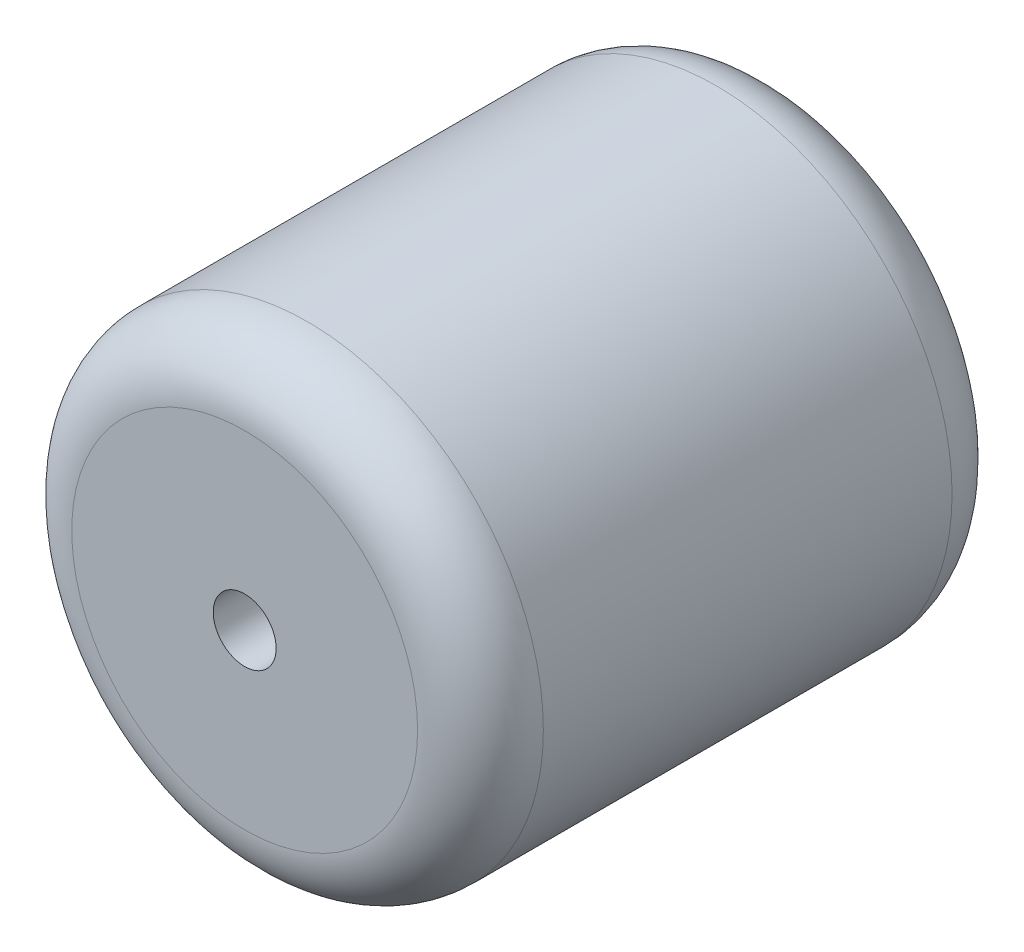
ISO-10303-21;
HEADER;
FILE_DESCRIPTION(('STEP AP214'),'2;1');
FILE_NAME('part.step','',(''),(''),'','','');
FILE_SCHEMA(('AUTOMOTIVE_DESIGN { 1 0 10303 214 1 1 1 1 }'));
ENDSEC;
DATA;
#1=APPLICATION_CONTEXT('core data for automotive mechanical design processes');
#2=APPLICATION_PROTOCOL_DEFINITION('international standard','automotive_design',2000,#1);
#3=PRODUCT_CONTEXT('',#1,'mechanical');
#4=PRODUCT('Part','Part','',(#3));
#5=PRODUCT_RELATED_PRODUCT_CATEGORY('part','',(#4));
#6=PRODUCT_DEFINITION_FORMATION('','',#4);
#7=PRODUCT_DEFINITION_CONTEXT('part definition',#1,'design');
#8=PRODUCT_DEFINITION('design','',#6,#7);
#9=PRODUCT_DEFINITION_SHAPE('','',#8);
#10=(LENGTH_UNIT() NAMED_UNIT(*) SI_UNIT(.MILLI.,.METRE.));
#11=(NAMED_UNIT(*) PLANE_ANGLE_UNIT() SI_UNIT($,.RADIAN.));
#12=(NAMED_UNIT(*) SI_UNIT($,.STERADIAN.) SOLID_ANGLE_UNIT());
#13=UNCERTAINTY_MEASURE_WITH_UNIT(LENGTH_MEASURE(1.E-05),#10,'distance_accuracy_value','');
#14=(GEOMETRIC_REPRESENTATION_CONTEXT(3) GLOBAL_UNCERTAINTY_ASSIGNED_CONTEXT((#13)) GLOBAL_UNIT_ASSIGNED_CONTEXT((#10,
#11,#12)) REPRESENTATION_CONTEXT('',''));
#15=CARTESIAN_POINT('',(0.,0.,0.));
#16=DIRECTION('',(0.,0.,1.));
#17=DIRECTION('',(1.,0.,0.));
#18=AXIS2_PLACEMENT_3D('',#15,#16,#17);
#19=CARTESIAN_POINT('',(0.,0.,2.));
#20=DIRECTION('',(0.,0.,1.));
#21=DIRECTION('',(1.,0.,0.));
#22=AXIS2_PLACEMENT_3D('',#19,#20,#21);
#23=TOROIDAL_SURFACE('',#22,5.5,2.);
#24=CARTESIAN_POINT('',(0.,0.,0.));
#25=DIRECTION('',(0.,0.,1.));
#26=DIRECTION('',(1.,0.,0.));
#27=AXIS2_PLACEMENT_3D('',#24,#25,#26);
#28=CIRCLE('',#27,5.5);
#29=CARTESIAN_POINT('',(5.5,0.,0.));
#30=VERTEX_POINT('',#29);
#31=EDGE_CURVE('E44',#30,#30,#28,.F.);
#32=ORIENTED_EDGE('',*,*,#31,.F.);
#33=EDGE_LOOP('',(#32));
#34=FACE_BOUND('',#33,.T.);
#35=CARTESIAN_POINT('',(0.,0.,2.));
#36=DIRECTION('',(0.,0.,1.));
#37=DIRECTION('',(1.,0.,0.));
#38=AXIS2_PLACEMENT_3D('',#35,#36,#37);
#39=CIRCLE('',#38,7.5);
#40=CARTESIAN_POINT('',(7.5,0.,2.));
#41=VERTEX_POINT('',#40);
#42=EDGE_CURVE('E10',#41,#41,#39,.T.);
#43=ORIENTED_EDGE('',*,*,#42,.F.);
#44=EDGE_LOOP('',(#43));
#45=FACE_BOUND('',#44,.T.);
#46=ADVANCED_FACE('F37',(#34,#45),#23,.T.);
#47=CARTESIAN_POINT('',(0.,0.,15.));
#48=DIRECTION('',(0.,0.,1.));
#49=DIRECTION('',(1.,0.,0.));
#50=AXIS2_PLACEMENT_3D('',#47,#48,#49);
#51=TOROIDAL_SURFACE('',#50,5.5,2.);
#52=CARTESIAN_POINT('',(0.,0.,17.));
#53=DIRECTION('',(0.,0.,1.));
#54=DIRECTION('',(1.,0.,0.));
#55=AXIS2_PLACEMENT_3D('',#52,#53,#54);
#56=CIRCLE('',#55,5.5);
#57=CARTESIAN_POINT('',(5.5,0.,17.));
#58=VERTEX_POINT('',#57);
#59=EDGE_CURVE('E54',#58,#58,#56,.T.);
#60=ORIENTED_EDGE('',*,*,#59,.F.);
#61=EDGE_LOOP('',(#60));
#62=FACE_BOUND('',#61,.T.);
#63=CARTESIAN_POINT('',(0.,0.,15.));
#64=DIRECTION('',(0.,0.,1.));
#65=DIRECTION('',(1.,0.,0.));
#66=AXIS2_PLACEMENT_3D('',#63,#64,#65);
#67=CIRCLE('',#66,7.5);
#68=CARTESIAN_POINT('',(7.5,0.,15.));
#69=VERTEX_POINT('',#68);
#70=EDGE_CURVE('E49',#69,#69,#67,.F.);
#71=ORIENTED_EDGE('',*,*,#70,.F.);
#72=EDGE_LOOP('',(#71));
#73=FACE_BOUND('',#72,.T.);
#74=ADVANCED_FACE('F87',(#62,#73),#51,.T.);
#75=CARTESIAN_POINT('',(0.,0.,17.));
#76=DIRECTION('',(0.,0.,-1.));
#77=DIRECTION('',(-1.,0.,0.));
#78=AXIS2_PLACEMENT_3D('',#75,#76,#77);
#79=CYLINDRICAL_SURFACE('',#78,7.5);
#80=ORIENTED_EDGE('',*,*,#42,.T.);
#81=EDGE_LOOP('',(#80));
#82=FACE_BOUND('',#81,.T.);
#83=ORIENTED_EDGE('',*,*,#70,.T.);
#84=EDGE_LOOP('',(#83));
#85=FACE_BOUND('',#84,.T.);
#86=ADVANCED_FACE('F79',(#82,#85),#79,.T.);
#87=CARTESIAN_POINT('',(0.,0.,17.));
#88=DIRECTION('',(0.,0.,1.));
#89=DIRECTION('',(1.,0.,0.));
#90=AXIS2_PLACEMENT_3D('',#87,#88,#89);
#91=PLANE('',#90);
#92=ORIENTED_EDGE('',*,*,#59,.T.);
#93=EDGE_LOOP('',(#92));
#94=FACE_BOUND('',#93,.T.);
#95=CARTESIAN_POINT('',(0.,0.,17.));
#96=DIRECTION('',(0.,0.,1.));
#97=DIRECTION('',(1.,0.,0.));
#98=AXIS2_PLACEMENT_3D('',#95,#96,#97);
#99=CIRCLE('',#98,1.);
#100=CARTESIAN_POINT('',(1.,0.,17.));
#101=VERTEX_POINT('',#100);
#102=EDGE_CURVE('E61',#101,#101,#99,.T.);
#103=ORIENTED_EDGE('',*,*,#102,.F.);
#104=EDGE_LOOP('',(#103));
#105=FACE_BOUND('',#104,.T.);
#106=ADVANCED_FACE('F77',(#94,#105),#91,.T.);
#107=CARTESIAN_POINT('',(0.,0.,0.));
#108=DIRECTION('',(0.,0.,1.));
#109=DIRECTION('',(1.,0.,0.));
#110=AXIS2_PLACEMENT_3D('',#107,#108,#109);
#111=PLANE('',#110);
#112=ORIENTED_EDGE('',*,*,#31,.T.);
#113=EDGE_LOOP('',(#112));
#114=FACE_BOUND('',#113,.T.);
#115=CARTESIAN_POINT('',(0.,0.,0.));
#116=DIRECTION('',(0.,0.,1.));
#117=DIRECTION('',(1.,0.,0.));
#118=AXIS2_PLACEMENT_3D('',#115,#116,#117);
#119=CIRCLE('',#118,1.);
#120=CARTESIAN_POINT('',(1.,0.,0.));
#121=VERTEX_POINT('',#120);
#122=EDGE_CURVE('E60',#121,#121,#119,.T.);
#123=ORIENTED_EDGE('',*,*,#122,.T.);
#124=EDGE_LOOP('',(#123));
#125=FACE_BOUND('',#124,.T.);
#126=ADVANCED_FACE('F69',(#114,#125),#111,.F.);
#127=CARTESIAN_POINT('',(0.,0.,0.));
#128=DIRECTION('',(0.,0.,1.));
#129=DIRECTION('',(1.,0.,0.));
#130=AXIS2_PLACEMENT_3D('',#127,#128,#129);
#131=CYLINDRICAL_SURFACE('',#130,1.);
#132=ORIENTED_EDGE('',*,*,#122,.F.);
#133=EDGE_LOOP('',(#132));
#134=FACE_BOUND('',#133,.T.);
#135=ORIENTED_EDGE('',*,*,#102,.T.);
#136=EDGE_LOOP('',(#135));
#137=FACE_BOUND('',#136,.T.);
#138=ADVANCED_FACE('F71',(#134,#137),#131,.F.);
#139=CLOSED_SHELL('',(#46,#74,#86,#106,#126,#138));
#140=MANIFOLD_SOLID_BREP('B2',#139);
#141=ADVANCED_BREP_SHAPE_REPRESENTATION('',(#18,#140),#14);
#142=SHAPE_DEFINITION_REPRESENTATION(#9,#141);
ENDSEC;
END-ISO-10303-21;
